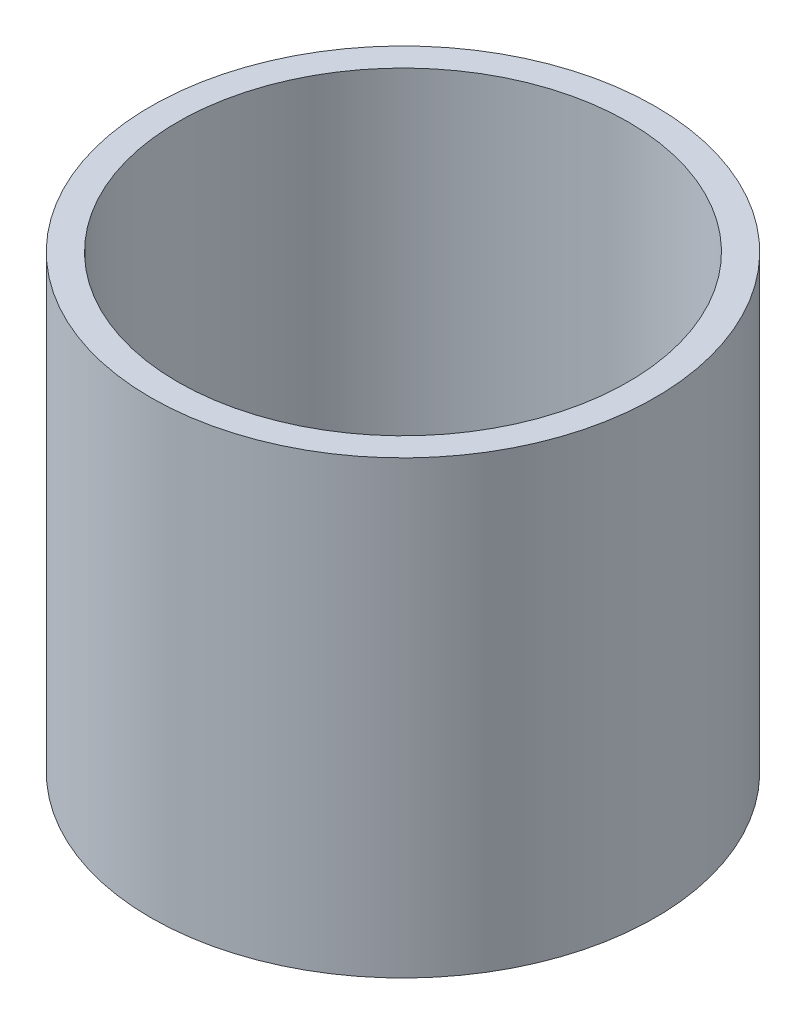
ISO-10303-21;
HEADER;
FILE_DESCRIPTION(('STEP AP214'),'2;1');
FILE_NAME('part.step','',(''),(''),'','','');
FILE_SCHEMA(('AUTOMOTIVE_DESIGN { 1 0 10303 214 1 1 1 1 }'));
ENDSEC;
DATA;
#1=APPLICATION_CONTEXT('core data for automotive mechanical design processes');
#2=APPLICATION_PROTOCOL_DEFINITION('international standard','automotive_design',2000,#1);
#3=PRODUCT_CONTEXT('',#1,'mechanical');
#4=PRODUCT('Part','Part','',(#3));
#5=PRODUCT_RELATED_PRODUCT_CATEGORY('part','',(#4));
#6=PRODUCT_DEFINITION_FORMATION('','',#4);
#7=PRODUCT_DEFINITION_CONTEXT('part definition',#1,'design');
#8=PRODUCT_DEFINITION('design','',#6,#7);
#9=PRODUCT_DEFINITION_SHAPE('','',#8);
#10=(LENGTH_UNIT() NAMED_UNIT(*) SI_UNIT(.MILLI.,.METRE.));
#11=(NAMED_UNIT(*) PLANE_ANGLE_UNIT() SI_UNIT($,.RADIAN.));
#12=(NAMED_UNIT(*) SI_UNIT($,.STERADIAN.) SOLID_ANGLE_UNIT());
#13=UNCERTAINTY_MEASURE_WITH_UNIT(LENGTH_MEASURE(1.E-05),#10,'distance_accuracy_value','');
#14=(GEOMETRIC_REPRESENTATION_CONTEXT(3) GLOBAL_UNCERTAINTY_ASSIGNED_CONTEXT((#13)) GLOBAL_UNIT_ASSIGNED_CONTEXT((#10,
#11,#12)) REPRESENTATION_CONTEXT('',''));
#15=CARTESIAN_POINT('',(0.,0.,0.));
#16=DIRECTION('',(0.,0.,1.));
#17=DIRECTION('',(1.,0.,0.));
#18=AXIS2_PLACEMENT_3D('',#15,#16,#17);
#19=CARTESIAN_POINT('',(0.,5.,0.));
#20=DIRECTION('',(0.,1.,0.));
#21=DIRECTION('',(0.,0.,1.));
#22=AXIS2_PLACEMENT_3D('',#19,#20,#21);
#23=PLANE('',#22);
#24=CARTESIAN_POINT('',(0.,5.,0.));
#25=DIRECTION('',(0.,1.,0.));
#26=DIRECTION('',(0.,0.,1.));
#27=AXIS2_PLACEMENT_3D('',#24,#25,#26);
#28=CIRCLE('',#27,2.8);
#29=CARTESIAN_POINT('',(0.,5.,2.8));
#30=VERTEX_POINT('',#29);
#31=EDGE_CURVE('E10',#30,#30,#28,.T.);
#32=ORIENTED_EDGE('',*,*,#31,.T.);
#33=EDGE_LOOP('',(#32));
#34=FACE_BOUND('',#33,.T.);
#35=CARTESIAN_POINT('',(0.,5.,0.));
#36=DIRECTION('',(0.,1.,0.));
#37=DIRECTION('',(0.,0.,1.));
#38=AXIS2_PLACEMENT_3D('',#35,#36,#37);
#39=CIRCLE('',#38,2.5);
#40=CARTESIAN_POINT('',(0.,5.,2.5));
#41=VERTEX_POINT('',#40);
#42=EDGE_CURVE('E48',#41,#41,#39,.T.);
#43=ORIENTED_EDGE('',*,*,#42,.F.);
#44=EDGE_LOOP('',(#43));
#45=FACE_BOUND('',#44,.T.);
#46=ADVANCED_FACE('F37',(#34,#45),#23,.T.);
#47=CARTESIAN_POINT('',(0.,0.,0.));
#48=DIRECTION('',(0.,1.,0.));
#49=DIRECTION('',(0.,0.,1.));
#50=AXIS2_PLACEMENT_3D('',#47,#48,#49);
#51=PLANE('',#50);
#52=CARTESIAN_POINT('',(0.,0.,0.));
#53=DIRECTION('',(0.,1.,0.));
#54=DIRECTION('',(0.,0.,1.));
#55=AXIS2_PLACEMENT_3D('',#52,#53,#54);
#56=CIRCLE('',#55,2.8);
#57=CARTESIAN_POINT('',(0.,0.,2.8));
#58=VERTEX_POINT('',#57);
#59=EDGE_CURVE('E41',#58,#58,#56,.T.);
#60=ORIENTED_EDGE('',*,*,#59,.F.);
#61=EDGE_LOOP('',(#60));
#62=FACE_BOUND('',#61,.T.);
#63=CARTESIAN_POINT('',(0.,0.,0.));
#64=DIRECTION('',(0.,1.,0.));
#65=DIRECTION('',(0.,0.,1.));
#66=AXIS2_PLACEMENT_3D('',#63,#64,#65);
#67=CIRCLE('',#66,2.5);
#68=CARTESIAN_POINT('',(0.,0.,2.5));
#69=VERTEX_POINT('',#68);
#70=EDGE_CURVE('E50',#69,#69,#67,.T.);
#71=ORIENTED_EDGE('',*,*,#70,.T.);
#72=EDGE_LOOP('',(#71));
#73=FACE_BOUND('',#72,.T.);
#74=ADVANCED_FACE('F60',(#62,#73),#51,.F.);
#75=CARTESIAN_POINT('',(0.,5.,0.));
#76=DIRECTION('',(0.,-1.,0.));
#77=DIRECTION('',(0.,0.,-1.));
#78=AXIS2_PLACEMENT_3D('',#75,#76,#77);
#79=CYLINDRICAL_SURFACE('',#78,2.8);
#80=ORIENTED_EDGE('',*,*,#31,.F.);
#81=EDGE_LOOP('',(#80));
#82=FACE_BOUND('',#81,.T.);
#83=ORIENTED_EDGE('',*,*,#59,.T.);
#84=EDGE_LOOP('',(#83));
#85=FACE_BOUND('',#84,.T.);
#86=ADVANCED_FACE('F39',(#82,#85),#79,.T.);
#87=CARTESIAN_POINT('',(0.,5.,0.));
#88=DIRECTION('',(0.,-1.,0.));
#89=DIRECTION('',(0.,0.,-1.));
#90=AXIS2_PLACEMENT_3D('',#87,#88,#89);
#91=CYLINDRICAL_SURFACE('',#90,2.5);
#92=ORIENTED_EDGE('',*,*,#42,.T.);
#93=EDGE_LOOP('',(#92));
#94=FACE_BOUND('',#93,.T.);
#95=ORIENTED_EDGE('',*,*,#70,.F.);
#96=EDGE_LOOP('',(#95));
#97=FACE_BOUND('',#96,.T.);
#98=ADVANCED_FACE('F56',(#94,#97),#91,.F.);
#99=CLOSED_SHELL('',(#46,#74,#86,#98));
#100=MANIFOLD_SOLID_BREP('B2',#99);
#101=ADVANCED_BREP_SHAPE_REPRESENTATION('',(#18,#100),#14);
#102=SHAPE_DEFINITION_REPRESENTATION(#9,#101);
ENDSEC;
END-ISO-10303-21;
